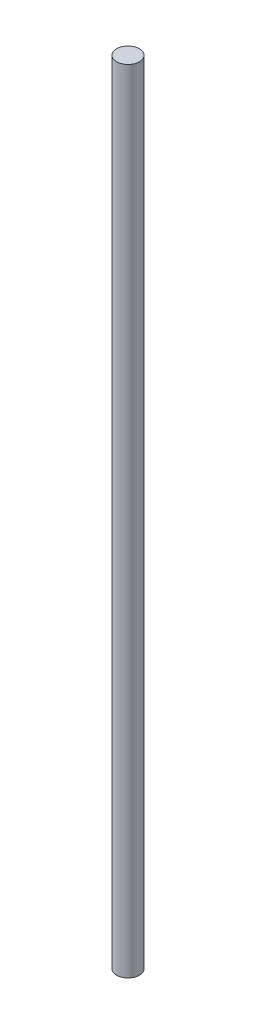
ISO-10303-21;
HEADER;
FILE_DESCRIPTION(('STEP AP214'),'2;1');
FILE_NAME('part.step','',(''),(''),'','','');
FILE_SCHEMA(('AUTOMOTIVE_DESIGN { 1 0 10303 214 1 1 1 1 }'));
ENDSEC;
DATA;
#1=APPLICATION_CONTEXT('core data for automotive mechanical design processes');
#2=APPLICATION_PROTOCOL_DEFINITION('international standard','automotive_design',2000,#1);
#3=PRODUCT_CONTEXT('',#1,'mechanical');
#4=PRODUCT('Part','Part','',(#3));
#5=PRODUCT_RELATED_PRODUCT_CATEGORY('part','',(#4));
#6=PRODUCT_DEFINITION_FORMATION('','',#4);
#7=PRODUCT_DEFINITION_CONTEXT('part definition',#1,'design');
#8=PRODUCT_DEFINITION('design','',#6,#7);
#9=PRODUCT_DEFINITION_SHAPE('','',#8);
#10=(LENGTH_UNIT() NAMED_UNIT(*) SI_UNIT(.MILLI.,.METRE.));
#11=(NAMED_UNIT(*) PLANE_ANGLE_UNIT() SI_UNIT($,.RADIAN.));
#12=(NAMED_UNIT(*) SI_UNIT($,.STERADIAN.) SOLID_ANGLE_UNIT());
#13=UNCERTAINTY_MEASURE_WITH_UNIT(LENGTH_MEASURE(1.E-05),#10,'distance_accuracy_value','');
#14=(GEOMETRIC_REPRESENTATION_CONTEXT(3) GLOBAL_UNCERTAINTY_ASSIGNED_CONTEXT((#13)) GLOBAL_UNIT_ASSIGNED_CONTEXT((#10,
#11,#12)) REPRESENTATION_CONTEXT('',''));
#15=CARTESIAN_POINT('',(0.,0.,0.));
#16=DIRECTION('',(0.,0.,1.));
#17=DIRECTION('',(1.,0.,0.));
#18=AXIS2_PLACEMENT_3D('',#15,#16,#17);
#19=CARTESIAN_POINT('',(0.,2438.4,0.));
#20=DIRECTION('',(0.,-1.,0.));
#21=DIRECTION('',(0.,0.,-1.));
#22=AXIS2_PLACEMENT_3D('',#19,#20,#21);
#23=CYLINDRICAL_SURFACE('',#22,34.925);
#24=CARTESIAN_POINT('',(0.,2438.4,0.));
#25=DIRECTION('',(0.,1.,0.));
#26=DIRECTION('',(0.,0.,1.));
#27=AXIS2_PLACEMENT_3D('',#24,#25,#26);
#28=CIRCLE('',#27,34.925);
#29=CARTESIAN_POINT('',(0.,2438.4,-34.925));
#30=VERTEX_POINT('',#29);
#31=EDGE_CURVE('E10',#30,#30,#28,.T.);
#32=CARTESIAN_POINT('',(0.,0.,0.));
#33=DIRECTION('',(0.,1.,0.));
#34=DIRECTION('',(0.,0.,1.));
#35=AXIS2_PLACEMENT_3D('',#32,#33,#34);
#36=CIRCLE('',#35,34.925);
#37=CARTESIAN_POINT('',(0.,0.,-34.925));
#38=VERTEX_POINT('',#37);
#39=EDGE_CURVE('E34',#38,#38,#36,.T.);
#40=CARTESIAN_POINT('',(0.,2438.4,-34.925));
#41=CARTESIAN_POINT('',(0.,2413.,-34.925));
#42=CARTESIAN_POINT('',(0.,2387.6,-34.925));
#43=CARTESIAN_POINT('',(0.,2336.8,-34.925));
#44=CARTESIAN_POINT('',(0.,2311.4,-34.925));
#45=CARTESIAN_POINT('',(0.,2260.6,-34.925));
#46=CARTESIAN_POINT('',(0.,2235.2,-34.925));
#47=CARTESIAN_POINT('',(0.,2184.4,-34.925));
#48=CARTESIAN_POINT('',(0.,2159.,-34.925));
#49=CARTESIAN_POINT('',(0.,2108.2,-34.925));
#50=CARTESIAN_POINT('',(0.,2082.8,-34.925));
#51=CARTESIAN_POINT('',(0.,2032.,-34.925));
#52=CARTESIAN_POINT('',(0.,2006.6,-34.925));
#53=CARTESIAN_POINT('',(0.,1955.8,-34.925));
#54=CARTESIAN_POINT('',(0.,1930.4,-34.925));
#55=CARTESIAN_POINT('',(0.,1879.6,-34.925));
#56=CARTESIAN_POINT('',(0.,1854.2,-34.925));
#57=CARTESIAN_POINT('',(0.,1803.4,-34.925));
#58=CARTESIAN_POINT('',(0.,1778.,-34.925));
#59=CARTESIAN_POINT('',(0.,1727.2,-34.925));
#60=CARTESIAN_POINT('',(0.,1701.8,-34.925));
#61=CARTESIAN_POINT('',(0.,1651.,-34.925));
#62=CARTESIAN_POINT('',(0.,1625.6,-34.925));
#63=CARTESIAN_POINT('',(0.,1574.8,-34.925));
#64=CARTESIAN_POINT('',(0.,1549.4,-34.925));
#65=CARTESIAN_POINT('',(0.,1498.6,-34.925));
#66=CARTESIAN_POINT('',(0.,1473.2,-34.925));
#67=CARTESIAN_POINT('',(0.,1422.4,-34.925));
#68=CARTESIAN_POINT('',(0.,1397.,-34.925));
#69=CARTESIAN_POINT('',(0.,1346.2,-34.925));
#70=CARTESIAN_POINT('',(0.,1320.8,-34.925));
#71=CARTESIAN_POINT('',(0.,1270.,-34.925));
#72=CARTESIAN_POINT('',(0.,1244.6,-34.925));
#73=CARTESIAN_POINT('',(0.,1193.8,-34.925));
#74=CARTESIAN_POINT('',(0.,1168.4,-34.925));
#75=CARTESIAN_POINT('',(0.,1117.6,-34.925));
#76=CARTESIAN_POINT('',(0.,1092.2,-34.925));
#77=CARTESIAN_POINT('',(0.,1041.4,-34.925));
#78=CARTESIAN_POINT('',(0.,1016.,-34.925));
#79=CARTESIAN_POINT('',(0.,965.2,-34.925));
#80=CARTESIAN_POINT('',(0.,939.8,-34.925));
#81=CARTESIAN_POINT('',(0.,889.,-34.925));
#82=CARTESIAN_POINT('',(0.,863.6,-34.925));
#83=CARTESIAN_POINT('',(0.,812.8,-34.925));
#84=CARTESIAN_POINT('',(0.,787.4,-34.925));
#85=CARTESIAN_POINT('',(0.,736.6,-34.925));
#86=CARTESIAN_POINT('',(0.,711.2,-34.925));
#87=CARTESIAN_POINT('',(0.,660.4,-34.925));
#88=CARTESIAN_POINT('',(0.,635.,-34.925));
#89=CARTESIAN_POINT('',(0.,584.2,-34.925));
#90=CARTESIAN_POINT('',(0.,558.8,-34.925));
#91=CARTESIAN_POINT('',(0.,508.,-34.925));
#92=CARTESIAN_POINT('',(0.,482.6,-34.925));
#93=CARTESIAN_POINT('',(0.,431.8,-34.925));
#94=CARTESIAN_POINT('',(0.,406.4,-34.925));
#95=CARTESIAN_POINT('',(0.,355.6,-34.925));
#96=CARTESIAN_POINT('',(0.,330.2,-34.925));
#97=CARTESIAN_POINT('',(0.,279.4,-34.925));
#98=CARTESIAN_POINT('',(0.,254.,-34.925));
#99=CARTESIAN_POINT('',(0.,203.2,-34.925));
#100=CARTESIAN_POINT('',(0.,177.8,-34.925));
#101=CARTESIAN_POINT('',(0.,127.,-34.925));
#102=CARTESIAN_POINT('',(0.,101.6,-34.925));
#103=CARTESIAN_POINT('',(0.,50.8,-34.925));
#104=CARTESIAN_POINT('',(0.,25.4,-34.925));
#105=CARTESIAN_POINT('',(0.,0.,-34.925));
#106=B_SPLINE_CURVE_WITH_KNOTS('',3,(#40,#41,#42,#43,#44,#45,#46,#47,#48,#49,#50,#51,#52,#53,
#54,#55,#56,#57,#58,#59,#60,#61,#62,#63,#64,#65,#66,#67,#68,#69,#70,#71,#72,#73,#74,#75,#76,#77,
#78,#79,#80,#81,#82,#83,#84,#85,#86,#87,#88,#89,#90,#91,#92,#93,#94,#95,#96,#97,#98,#99,#100,
#101,#102,#103,#104,#105),.UNSPECIFIED.,.F.,.F.,(4,2,2,2,2,2,2,2,2,2,2,2,2,2,2,2,2,2,2,2,2,2,2,
2,2,2,2,2,2,2,2,2,4),(0.,76.1999999999996,152.4,228.6,304.8,381.,457.2,533.4,609.6,685.8,762.,
838.2,914.4,990.6,1066.8,1143.,1219.2,1295.4,1371.6,1447.8,1524.,1600.2,1676.4,1752.6,1828.8,
1905.,1981.2,2057.4,2133.6,2209.8,2286.,2362.2,2438.4),.UNSPECIFIED.);
#107=EDGE_CURVE('BSEAM31',#30,#38,#106,.T.);
#108=ORIENTED_EDGE('',*,*,#31,.F.);
#109=ORIENTED_EDGE('',*,*,#39,.T.);
#110=ORIENTED_EDGE('',*,*,#107,.T.);
#111=ORIENTED_EDGE('',*,*,#107,.F.);
#112=EDGE_LOOP('',(#108,#110,#109,#111));
#113=FACE_BOUND('',#112,.T.);
#114=ADVANCED_FACE('F31',(#113),#23,.T.);
#115=CARTESIAN_POINT('',(0.,2438.4,0.));
#116=DIRECTION('',(0.,1.,0.));
#117=DIRECTION('',(0.,0.,1.));
#118=AXIS2_PLACEMENT_3D('',#115,#116,#117);
#119=PLANE('',#118);
#120=ORIENTED_EDGE('',*,*,#31,.T.);
#121=EDGE_LOOP('',(#120));
#122=FACE_BOUND('',#121,.T.);
#123=ADVANCED_FACE('F46',(#122),#119,.T.);
#124=CARTESIAN_POINT('',(0.,0.,0.));
#125=DIRECTION('',(0.,1.,0.));
#126=DIRECTION('',(0.,0.,1.));
#127=AXIS2_PLACEMENT_3D('',#124,#125,#126);
#128=PLANE('',#127);
#129=ORIENTED_EDGE('',*,*,#39,.F.);
#130=EDGE_LOOP('',(#129));
#131=FACE_BOUND('',#130,.T.);
#132=ADVANCED_FACE('F44',(#131),#128,.F.);
#133=CLOSED_SHELL('',(#114,#123,#132));
#134=MANIFOLD_SOLID_BREP('B2',#133);
#135=ADVANCED_BREP_SHAPE_REPRESENTATION('',(#18,#134),#14);
#136=SHAPE_DEFINITION_REPRESENTATION(#9,#135);
ENDSEC;
END-ISO-10303-21;
